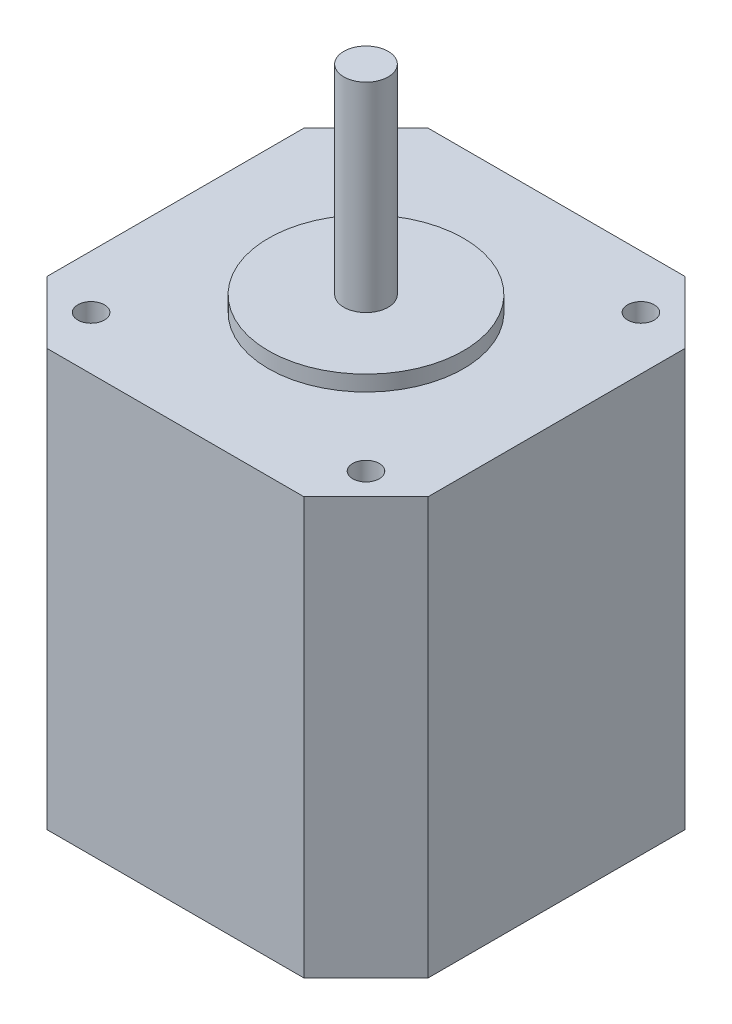
ISO-10303-21;
HEADER;
FILE_DESCRIPTION(('STEP AP214'),'2;1');
FILE_NAME('part.step','',(''),(''),'','','');
FILE_SCHEMA(('AUTOMOTIVE_DESIGN { 1 0 10303 214 1 1 1 1 }'));
ENDSEC;
DATA;
#1=APPLICATION_CONTEXT('core data for automotive mechanical design processes');
#2=APPLICATION_PROTOCOL_DEFINITION('international standard','automotive_design',2000,#1);
#3=PRODUCT_CONTEXT('',#1,'mechanical');
#4=PRODUCT('Part','Part','',(#3));
#5=PRODUCT_RELATED_PRODUCT_CATEGORY('part','',(#4));
#6=PRODUCT_DEFINITION_FORMATION('','',#4);
#7=PRODUCT_DEFINITION_CONTEXT('part definition',#1,'design');
#8=PRODUCT_DEFINITION('design','',#6,#7);
#9=PRODUCT_DEFINITION_SHAPE('','',#8);
#10=(LENGTH_UNIT() NAMED_UNIT(*) SI_UNIT(.MILLI.,.METRE.));
#11=(NAMED_UNIT(*) PLANE_ANGLE_UNIT() SI_UNIT($,.RADIAN.));
#12=(NAMED_UNIT(*) SI_UNIT($,.STERADIAN.) SOLID_ANGLE_UNIT());
#13=UNCERTAINTY_MEASURE_WITH_UNIT(LENGTH_MEASURE(1.E-05),#10,'distance_accuracy_value','');
#14=(GEOMETRIC_REPRESENTATION_CONTEXT(3) GLOBAL_UNCERTAINTY_ASSIGNED_CONTEXT((#13)) GLOBAL_UNIT_ASSIGNED_CONTEXT((#10,
#11,#12)) REPRESENTATION_CONTEXT('',''));
#15=CARTESIAN_POINT('',(0.,0.,0.));
#16=DIRECTION('',(0.,0.,1.));
#17=DIRECTION('',(1.,0.,0.));
#18=AXIS2_PLACEMENT_3D('',#15,#16,#17);
#19=CARTESIAN_POINT('',(49.,-216.5,-49.));
#20=DIRECTION('',(0.,1.,0.));
#21=DIRECTION('',(0.,0.,1.));
#22=AXIS2_PLACEMENT_3D('',#19,#20,#21);
#23=CYLINDRICAL_SURFACE('',#22,2.5);
#24=CARTESIAN_POINT('',(49.,-216.5,-49.));
#25=DIRECTION('',(0.,-1.,0.));
#26=DIRECTION('',(0.,0.,-1.));
#27=AXIS2_PLACEMENT_3D('',#24,#25,#26);
#28=CIRCLE('',#27,2.5);
#29=CARTESIAN_POINT('',(49.,-216.5,-46.5));
#30=VERTEX_POINT('',#29);
#31=EDGE_CURVE('E11',#30,#30,#28,.T.);
#32=CARTESIAN_POINT('',(49.,-194.,-49.));
#33=DIRECTION('',(0.,-1.,0.));
#34=DIRECTION('',(0.,0.,-1.));
#35=AXIS2_PLACEMENT_3D('',#32,#33,#34);
#36=CIRCLE('',#35,2.5);
#37=CARTESIAN_POINT('',(49.,-194.,-46.5));
#38=VERTEX_POINT('',#37);
#39=EDGE_CURVE('E35',#38,#38,#36,.T.);
#40=CARTESIAN_POINT('',(49.,-216.5,-46.5));
#41=CARTESIAN_POINT('',(49.,-216.265625,-46.5));
#42=CARTESIAN_POINT('',(49.,-216.03125,-46.5));
#43=CARTESIAN_POINT('',(49.,-215.5625,-46.5));
#44=CARTESIAN_POINT('',(49.,-215.328125,-46.5));
#45=CARTESIAN_POINT('',(49.,-214.859375,-46.5));
#46=CARTESIAN_POINT('',(49.,-214.625,-46.5));
#47=CARTESIAN_POINT('',(49.,-214.15625,-46.5));
#48=CARTESIAN_POINT('',(49.,-213.921875,-46.5));
#49=CARTESIAN_POINT('',(49.,-213.453125,-46.5));
#50=CARTESIAN_POINT('',(49.,-213.21875,-46.5));
#51=CARTESIAN_POINT('',(49.,-212.75,-46.5));
#52=CARTESIAN_POINT('',(49.,-212.515625,-46.5));
#53=CARTESIAN_POINT('',(49.,-212.046875,-46.5));
#54=CARTESIAN_POINT('',(49.,-211.8125,-46.5));
#55=CARTESIAN_POINT('',(49.,-211.34375,-46.5));
#56=CARTESIAN_POINT('',(49.,-211.109375,-46.5));
#57=CARTESIAN_POINT('',(49.,-210.640625,-46.5));
#58=CARTESIAN_POINT('',(49.,-210.40625,-46.5));
#59=CARTESIAN_POINT('',(49.,-209.9375,-46.5));
#60=CARTESIAN_POINT('',(49.,-209.703125,-46.5));
#61=CARTESIAN_POINT('',(49.,-209.234375,-46.5));
#62=CARTESIAN_POINT('',(49.,-209.,-46.5));
#63=CARTESIAN_POINT('',(49.,-208.53125,-46.5));
#64=CARTESIAN_POINT('',(49.,-208.296875,-46.5));
#65=CARTESIAN_POINT('',(49.,-207.828125,-46.5));
#66=CARTESIAN_POINT('',(49.,-207.59375,-46.5));
#67=CARTESIAN_POINT('',(49.,-207.125,-46.5));
#68=CARTESIAN_POINT('',(49.,-206.890625,-46.5));
#69=CARTESIAN_POINT('',(49.,-206.421875,-46.5));
#70=CARTESIAN_POINT('',(49.,-206.1875,-46.5));
#71=CARTESIAN_POINT('',(49.,-205.71875,-46.5));
#72=CARTESIAN_POINT('',(49.,-205.484375,-46.5));
#73=CARTESIAN_POINT('',(49.,-205.015625,-46.5));
#74=CARTESIAN_POINT('',(49.,-204.78125,-46.5));
#75=CARTESIAN_POINT('',(49.,-204.3125,-46.5));
#76=CARTESIAN_POINT('',(49.,-204.078125,-46.5));
#77=CARTESIAN_POINT('',(49.,-203.609375,-46.5));
#78=CARTESIAN_POINT('',(49.,-203.375,-46.5));
#79=CARTESIAN_POINT('',(49.,-202.90625,-46.5));
#80=CARTESIAN_POINT('',(49.,-202.671875,-46.5));
#81=CARTESIAN_POINT('',(49.,-202.203125,-46.5));
#82=CARTESIAN_POINT('',(49.,-201.96875,-46.5));
#83=CARTESIAN_POINT('',(49.,-201.5,-46.5));
#84=CARTESIAN_POINT('',(49.,-201.265625,-46.5));
#85=CARTESIAN_POINT('',(49.,-200.796875,-46.5));
#86=CARTESIAN_POINT('',(49.,-200.5625,-46.5));
#87=CARTESIAN_POINT('',(49.,-200.09375,-46.5));
#88=CARTESIAN_POINT('',(49.,-199.859375,-46.5));
#89=CARTESIAN_POINT('',(49.,-199.390625,-46.5));
#90=CARTESIAN_POINT('',(49.,-199.15625,-46.5));
#91=CARTESIAN_POINT('',(49.,-198.6875,-46.5));
#92=CARTESIAN_POINT('',(49.,-198.453125,-46.5));
#93=CARTESIAN_POINT('',(49.,-197.984375,-46.5));
#94=CARTESIAN_POINT('',(49.,-197.75,-46.5));
#95=CARTESIAN_POINT('',(49.,-197.28125,-46.5));
#96=CARTESIAN_POINT('',(49.,-197.046875,-46.5));
#97=CARTESIAN_POINT('',(49.,-196.578125,-46.5));
#98=CARTESIAN_POINT('',(49.,-196.34375,-46.5));
#99=CARTESIAN_POINT('',(49.,-195.875,-46.5));
#100=CARTESIAN_POINT('',(49.,-195.640625,-46.5));
#101=CARTESIAN_POINT('',(49.,-195.171875,-46.5));
#102=CARTESIAN_POINT('',(49.,-194.9375,-46.5));
#103=CARTESIAN_POINT('',(49.,-194.46875,-46.5));
#104=CARTESIAN_POINT('',(49.,-194.234375,-46.5));
#105=CARTESIAN_POINT('',(49.,-194.,-46.5));
#106=B_SPLINE_CURVE_WITH_KNOTS('',3,(#40,#41,#42,#43,#44,#45,#46,#47,#48,#49,#50,#51,#52,#53,
#54,#55,#56,#57,#58,#59,#60,#61,#62,#63,#64,#65,#66,#67,#68,#69,#70,#71,#72,#73,#74,#75,#76,#77,
#78,#79,#80,#81,#82,#83,#84,#85,#86,#87,#88,#89,#90,#91,#92,#93,#94,#95,#96,#97,#98,#99,#100,
#101,#102,#103,#104,#105),.UNSPECIFIED.,.F.,.F.,(4,2,2,2,2,2,2,2,2,2,2,2,2,2,2,2,2,2,2,2,2,2,2,
2,2,2,2,2,2,2,2,2,4),(0.,0.703125000000027,1.40625000000003,2.10937500000002,2.81250000000002,
3.51562500000002,4.21875000000002,4.92187500000002,5.62500000000002,6.32812500000002,
7.03125000000002,7.73437500000002,8.43750000000001,9.14062500000001,9.84375000000001,10.546875,
11.25,11.953125,12.65625,13.359375,14.0625,14.765625,15.46875,16.171875,16.875,17.578125,
18.28125,18.984375,19.6875,20.390625,21.09375,21.796875,22.5),.UNSPECIFIED.);
#107=EDGE_CURVE('BSEAM32',#30,#38,#106,.T.);
#108=ORIENTED_EDGE('',*,*,#31,.F.);
#109=ORIENTED_EDGE('',*,*,#39,.T.);
#110=ORIENTED_EDGE('',*,*,#107,.T.);
#111=ORIENTED_EDGE('',*,*,#107,.F.);
#112=EDGE_LOOP('',(#108,#110,#109,#111));
#113=FACE_BOUND('',#112,.T.);
#114=ADVANCED_FACE('F32',(#113),#23,.T.);
#115=CARTESIAN_POINT('',(49.,-194.,-49.));
#116=DIRECTION('',(0.,-1.,0.));
#117=DIRECTION('',(0.,0.,-1.));
#118=AXIS2_PLACEMENT_3D('',#115,#116,#117);
#119=PLANE('',#118);
#120=ORIENTED_EDGE('',*,*,#39,.F.);
#121=EDGE_LOOP('',(#120));
#122=FACE_BOUND('',#121,.T.);
#123=ADVANCED_FACE('F171',(#122),#119,.F.);
#124=CARTESIAN_POINT('',(49.,-216.5,-49.));
#125=DIRECTION('',(0.,-1.,0.));
#126=DIRECTION('',(0.,0.,-1.));
#127=AXIS2_PLACEMENT_3D('',#124,#125,#126);
#128=PLANE('',#127);
#129=CARTESIAN_POINT('',(49.,-216.5,-49.));
#130=DIRECTION('',(0.,-1.,0.));
#131=DIRECTION('',(0.,0.,-1.));
#132=AXIS2_PLACEMENT_3D('',#129,#130,#131);
#133=CIRCLE('',#132,11.);
#134=CARTESIAN_POINT('',(49.,-216.5,-60.));
#135=VERTEX_POINT('',#134);
#136=EDGE_CURVE('E159',#135,#135,#133,.T.);
#137=ORIENTED_EDGE('',*,*,#136,.F.);
#138=EDGE_LOOP('',(#137));
#139=FACE_BOUND('',#138,.T.);
#140=ORIENTED_EDGE('',*,*,#31,.T.);
#141=EDGE_LOOP('',(#140));
#142=FACE_BOUND('',#141,.T.);
#143=ADVANCED_FACE('F168',(#139,#142),#128,.F.);
#144=CARTESIAN_POINT('',(49.,-218.25,-49.));
#145=DIRECTION('',(0.,1.,0.));
#146=DIRECTION('',(0.,0.,1.));
#147=AXIS2_PLACEMENT_3D('',#144,#145,#146);
#148=CYLINDRICAL_SURFACE('',#147,11.);
#149=CARTESIAN_POINT('',(49.,-218.25,-49.));
#150=DIRECTION('',(0.,-1.,0.));
#151=DIRECTION('',(0.,0.,-1.));
#152=AXIS2_PLACEMENT_3D('',#149,#150,#151);
#153=CIRCLE('',#152,11.);
#154=CARTESIAN_POINT('',(49.,-218.25,-60.));
#155=VERTEX_POINT('',#154);
#156=EDGE_CURVE('E160',#155,#155,#153,.T.);
#157=ORIENTED_EDGE('',*,*,#156,.F.);
#158=EDGE_LOOP('',(#157));
#159=FACE_BOUND('',#158,.T.);
#160=ORIENTED_EDGE('',*,*,#136,.T.);
#161=EDGE_LOOP('',(#160));
#162=FACE_BOUND('',#161,.T.);
#163=ADVANCED_FACE('F166',(#159,#162),#148,.T.);
#164=CARTESIAN_POINT('',(0.,-218.25,0.));
#165=DIRECTION('',(0.,1.,0.));
#166=DIRECTION('',(0.,0.,1.));
#167=AXIS2_PLACEMENT_3D('',#164,#165,#166);
#168=PLANE('',#167);
#169=CARTESIAN_POINT('',(64.5000000000003,-218.25,-33.5));
#170=DIRECTION('',(0.,1.,0.));
#171=DIRECTION('',(0.,0.,1.));
#172=AXIS2_PLACEMENT_3D('',#169,#170,#171);
#173=CIRCLE('',#172,1.5);
#174=CARTESIAN_POINT('',(64.5000000000003,-218.25,-32.));
#175=VERTEX_POINT('',#174);
#176=EDGE_CURVE('E243',#175,#175,#173,.T.);
#177=ORIENTED_EDGE('',*,*,#176,.F.);
#178=EDGE_LOOP('',(#177));
#179=FACE_BOUND('',#178,.T.);
#180=CARTESIAN_POINT('',(33.5000000000003,-218.25,-33.4999999999998));
#181=DIRECTION('',(0.,1.,0.));
#182=DIRECTION('',(0.,0.,1.));
#183=AXIS2_PLACEMENT_3D('',#180,#181,#182);
#184=CIRCLE('',#183,1.5);
#185=CARTESIAN_POINT('',(33.5000000000003,-218.25,-31.9999999999998));
#186=VERTEX_POINT('',#185);
#187=EDGE_CURVE('E245',#186,#186,#184,.T.);
#188=ORIENTED_EDGE('',*,*,#187,.F.);
#189=EDGE_LOOP('',(#188));
#190=FACE_BOUND('',#189,.T.);
#191=CARTESIAN_POINT('',(33.5,-218.25,-64.4999999999998));
#192=DIRECTION('',(0.,1.,0.));
#193=DIRECTION('',(0.,0.,1.));
#194=AXIS2_PLACEMENT_3D('',#191,#192,#193);
#195=CIRCLE('',#194,1.5);
#196=CARTESIAN_POINT('',(33.5,-218.25,-62.9999999999998));
#197=VERTEX_POINT('',#196);
#198=EDGE_CURVE('E251',#197,#197,#195,.T.);
#199=ORIENTED_EDGE('',*,*,#198,.F.);
#200=EDGE_LOOP('',(#199));
#201=FACE_BOUND('',#200,.T.);
#202=CARTESIAN_POINT('',(64.5,-218.25,-64.5));
#203=DIRECTION('',(0.,1.,0.));
#204=DIRECTION('',(0.,0.,1.));
#205=AXIS2_PLACEMENT_3D('',#202,#203,#204);
#206=CIRCLE('',#205,1.5);
#207=CARTESIAN_POINT('',(64.5,-218.25,-63.));
#208=VERTEX_POINT('',#207);
#209=EDGE_CURVE('E257',#208,#208,#206,.T.);
#210=ORIENTED_EDGE('',*,*,#209,.F.);
#211=EDGE_LOOP('',(#210));
#212=FACE_BOUND('',#211,.T.);
#213=DIRECTION('',(-0.707106781186548,0.,-0.707106781186547));
#214=VECTOR('',#213,1.);
#215=CARTESIAN_POINT('',(27.5,-218.25,-34.5));
#216=LINE('',#215,#214);
#217=CARTESIAN_POINT('',(34.5,-218.25,-27.5));
#218=VERTEX_POINT('',#217);
#219=CARTESIAN_POINT('',(27.5,-218.25,-34.5));
#220=VERTEX_POINT('',#219);
#221=EDGE_CURVE('E129',#218,#220,#216,.T.);
#222=ORIENTED_EDGE('',*,*,#221,.F.);
#223=DIRECTION('',(-1.,0.,0.));
#224=VECTOR('',#223,1.);
#225=CARTESIAN_POINT('',(34.5,-218.25,-27.5));
#226=LINE('',#225,#224);
#227=CARTESIAN_POINT('',(63.5,-218.25,-27.5));
#228=VERTEX_POINT('',#227);
#229=EDGE_CURVE('E83',#228,#218,#226,.T.);
#230=ORIENTED_EDGE('',*,*,#229,.F.);
#231=DIRECTION('',(-0.707106781186548,0.,0.707106781186547));
#232=VECTOR('',#231,1.);
#233=CARTESIAN_POINT('',(63.5,-218.25,-27.5));
#234=LINE('',#233,#232);
#235=CARTESIAN_POINT('',(70.5,-218.25,-34.5));
#236=VERTEX_POINT('',#235);
#237=EDGE_CURVE('E77',#236,#228,#234,.T.);
#238=ORIENTED_EDGE('',*,*,#237,.F.);
#239=DIRECTION('',(0.,0.,1.));
#240=VECTOR('',#239,1.);
#241=CARTESIAN_POINT('',(70.5,-218.25,-34.5));
#242=LINE('',#241,#240);
#243=CARTESIAN_POINT('',(70.5,-218.25,-63.5));
#244=VERTEX_POINT('',#243);
#245=EDGE_CURVE('E119',#244,#236,#242,.T.);
#246=ORIENTED_EDGE('',*,*,#245,.F.);
#247=DIRECTION('',(0.707106781186547,0.,0.707106781186547));
#248=VECTOR('',#247,1.);
#249=CARTESIAN_POINT('',(63.5,-218.25,-70.5));
#250=LINE('',#249,#248);
#251=CARTESIAN_POINT('',(63.5,-218.25,-70.5));
#252=VERTEX_POINT('',#251);
#253=EDGE_CURVE('E139',#252,#244,#250,.T.);
#254=ORIENTED_EDGE('',*,*,#253,.F.);
#255=DIRECTION('',(1.,0.,0.));
#256=VECTOR('',#255,1.);
#257=CARTESIAN_POINT('',(34.5,-218.25,-70.5));
#258=LINE('',#257,#256);
#259=CARTESIAN_POINT('',(34.5,-218.25,-70.5));
#260=VERTEX_POINT('',#259);
#261=EDGE_CURVE('E137',#260,#252,#258,.T.);
#262=ORIENTED_EDGE('',*,*,#261,.F.);
#263=DIRECTION('',(0.707106781186547,0.,-0.707106781186548));
#264=VECTOR('',#263,1.);
#265=CARTESIAN_POINT('',(27.5,-218.25,-63.5));
#266=LINE('',#265,#264);
#267=CARTESIAN_POINT('',(27.5,-218.25,-63.5));
#268=VERTEX_POINT('',#267);
#269=EDGE_CURVE('E135',#268,#260,#266,.T.);
#270=ORIENTED_EDGE('',*,*,#269,.F.);
#271=DIRECTION('',(0.,0.,-1.));
#272=VECTOR('',#271,1.);
#273=CARTESIAN_POINT('',(27.5,-218.25,-34.5));
#274=LINE('',#273,#272);
#275=EDGE_CURVE('E132',#220,#268,#274,.T.);
#276=ORIENTED_EDGE('',*,*,#275,.F.);
#277=EDGE_LOOP('',(#222,#230,#238,#246,#254,#262,#270,#276));
#278=FACE_BOUND('',#277,.T.);
#279=ORIENTED_EDGE('',*,*,#156,.T.);
#280=EDGE_LOOP('',(#279));
#281=FACE_BOUND('',#280,.T.);
#282=ADVANCED_FACE('F185',(#179,#190,#201,#212,#278,#281),#168,.T.);
#283=CARTESIAN_POINT('',(27.5,-265.25,-34.5));
#284=DIRECTION('',(0.707106781186547,0.,-0.707106781186548));
#285=DIRECTION('',(-0.707106781186548,0.,-0.707106781186547));
#286=AXIS2_PLACEMENT_3D('',#283,#284,#285);
#287=PLANE('',#286);
#288=ORIENTED_EDGE('',*,*,#221,.T.);
#289=DIRECTION('',(0.,1.,0.));
#290=VECTOR('',#289,1.);
#291=CARTESIAN_POINT('',(27.5,-265.25,-34.5));
#292=LINE('',#291,#290);
#293=CARTESIAN_POINT('',(27.5,-265.25,-34.5));
#294=VERTEX_POINT('',#293);
#295=EDGE_CURVE('E157',#294,#220,#292,.T.);
#296=ORIENTED_EDGE('',*,*,#295,.F.);
#297=DIRECTION('',(-0.707106781186548,0.,-0.707106781186547));
#298=VECTOR('',#297,1.);
#299=CARTESIAN_POINT('',(27.5,-265.25,-34.5));
#300=LINE('',#299,#298);
#301=CARTESIAN_POINT('',(34.5,-265.25,-27.5));
#302=VERTEX_POINT('',#301);
#303=EDGE_CURVE('E144',#302,#294,#300,.T.);
#304=ORIENTED_EDGE('',*,*,#303,.F.);
#305=DIRECTION('',(0.,1.,0.));
#306=VECTOR('',#305,1.);
#307=CARTESIAN_POINT('',(34.5,-265.25,-27.5));
#308=LINE('',#307,#306);
#309=EDGE_CURVE('E125',#302,#218,#308,.T.);
#310=ORIENTED_EDGE('',*,*,#309,.T.);
#311=EDGE_LOOP('',(#288,#296,#304,#310));
#312=FACE_BOUND('',#311,.T.);
#313=ADVANCED_FACE('F188',(#312),#287,.F.);
#314=CARTESIAN_POINT('',(27.5,-265.25,-34.5));
#315=DIRECTION('',(1.,0.,0.));
#316=DIRECTION('',(0.,0.,-1.));
#317=AXIS2_PLACEMENT_3D('',#314,#315,#316);
#318=PLANE('',#317);
#319=ORIENTED_EDGE('',*,*,#275,.T.);
#320=DIRECTION('',(0.,1.,0.));
#321=VECTOR('',#320,1.);
#322=CARTESIAN_POINT('',(27.5,-265.25,-63.5));
#323=LINE('',#322,#321);
#324=CARTESIAN_POINT('',(27.5,-265.25,-63.5));
#325=VERTEX_POINT('',#324);
#326=EDGE_CURVE('E154',#325,#268,#323,.T.);
#327=ORIENTED_EDGE('',*,*,#326,.F.);
#328=DIRECTION('',(0.,0.,-1.));
#329=VECTOR('',#328,1.);
#330=CARTESIAN_POINT('',(27.5,-265.25,-34.5));
#331=LINE('',#330,#329);
#332=EDGE_CURVE('E92',#294,#325,#331,.T.);
#333=ORIENTED_EDGE('',*,*,#332,.F.);
#334=ORIENTED_EDGE('',*,*,#295,.T.);
#335=EDGE_LOOP('',(#319,#327,#333,#334));
#336=FACE_BOUND('',#335,.T.);
#337=ADVANCED_FACE('F191',(#336),#318,.F.);
#338=CARTESIAN_POINT('',(27.5,-265.25,-63.5));
#339=DIRECTION('',(0.707106781186548,0.,0.707106781186547));
#340=DIRECTION('',(0.707106781186547,0.,-0.707106781186548));
#341=AXIS2_PLACEMENT_3D('',#338,#339,#340);
#342=PLANE('',#341);
#343=ORIENTED_EDGE('',*,*,#269,.T.);
#344=DIRECTION('',(0.,1.,0.));
#345=VECTOR('',#344,1.);
#346=CARTESIAN_POINT('',(34.5,-265.25,-70.5));
#347=LINE('',#346,#345);
#348=CARTESIAN_POINT('',(34.5,-265.25,-70.5));
#349=VERTEX_POINT('',#348);
#350=EDGE_CURVE('E151',#349,#260,#347,.T.);
#351=ORIENTED_EDGE('',*,*,#350,.F.);
#352=DIRECTION('',(0.707106781186547,0.,-0.707106781186548));
#353=VECTOR('',#352,1.);
#354=CARTESIAN_POINT('',(27.5,-265.25,-63.5));
#355=LINE('',#354,#353);
#356=EDGE_CURVE('E266',#325,#349,#355,.T.);
#357=ORIENTED_EDGE('',*,*,#356,.F.);
#358=ORIENTED_EDGE('',*,*,#326,.T.);
#359=EDGE_LOOP('',(#343,#351,#357,#358));
#360=FACE_BOUND('',#359,.T.);
#361=ADVANCED_FACE('F195',(#360),#342,.F.);
#362=CARTESIAN_POINT('',(34.5,-265.25,-70.5));
#363=DIRECTION('',(0.,0.,1.));
#364=DIRECTION('',(1.,0.,0.));
#365=AXIS2_PLACEMENT_3D('',#362,#363,#364);
#366=PLANE('',#365);
#367=ORIENTED_EDGE('',*,*,#261,.T.);
#368=DIRECTION('',(0.,1.,0.));
#369=VECTOR('',#368,1.);
#370=CARTESIAN_POINT('',(63.5,-265.25,-70.5));
#371=LINE('',#370,#369);
#372=CARTESIAN_POINT('',(63.5,-265.25,-70.5));
#373=VERTEX_POINT('',#372);
#374=EDGE_CURVE('E148',#373,#252,#371,.T.);
#375=ORIENTED_EDGE('',*,*,#374,.F.);
#376=DIRECTION('',(1.,0.,0.));
#377=VECTOR('',#376,1.);
#378=CARTESIAN_POINT('',(34.5,-265.25,-70.5));
#379=LINE('',#378,#377);
#380=EDGE_CURVE('E268',#349,#373,#379,.T.);
#381=ORIENTED_EDGE('',*,*,#380,.F.);
#382=ORIENTED_EDGE('',*,*,#350,.T.);
#383=EDGE_LOOP('',(#367,#375,#381,#382));
#384=FACE_BOUND('',#383,.T.);
#385=ADVANCED_FACE('F198',(#384),#366,.F.);
#386=CARTESIAN_POINT('',(63.5,-265.25,-70.5));
#387=DIRECTION('',(-0.707106781186547,0.,0.707106781186547));
#388=DIRECTION('',(0.707106781186548,0.,0.707106781186548));
#389=AXIS2_PLACEMENT_3D('',#386,#387,#388);
#390=PLANE('',#389);
#391=ORIENTED_EDGE('',*,*,#253,.T.);
#392=DIRECTION('',(0.,1.,0.));
#393=VECTOR('',#392,1.);
#394=CARTESIAN_POINT('',(70.5,-265.25,-63.5));
#395=LINE('',#394,#393);
#396=CARTESIAN_POINT('',(70.5,-265.25,-63.5));
#397=VERTEX_POINT('',#396);
#398=EDGE_CURVE('E120',#397,#244,#395,.T.);
#399=ORIENTED_EDGE('',*,*,#398,.F.);
#400=DIRECTION('',(0.707106781186547,0.,0.707106781186547));
#401=VECTOR('',#400,1.);
#402=CARTESIAN_POINT('',(63.5,-265.25,-70.5));
#403=LINE('',#402,#401);
#404=EDGE_CURVE('E111',#373,#397,#403,.T.);
#405=ORIENTED_EDGE('',*,*,#404,.F.);
#406=ORIENTED_EDGE('',*,*,#374,.T.);
#407=EDGE_LOOP('',(#391,#399,#405,#406));
#408=FACE_BOUND('',#407,.T.);
#409=ADVANCED_FACE('F202',(#408),#390,.F.);
#410=CARTESIAN_POINT('',(70.5,-265.25,-34.5));
#411=DIRECTION('',(-1.,0.,0.));
#412=DIRECTION('',(0.,0.,1.));
#413=AXIS2_PLACEMENT_3D('',#410,#411,#412);
#414=PLANE('',#413);
#415=ORIENTED_EDGE('',*,*,#245,.T.);
#416=DIRECTION('',(0.,1.,0.));
#417=VECTOR('',#416,1.);
#418=CARTESIAN_POINT('',(70.5,-265.25,-34.5));
#419=LINE('',#418,#417);
#420=CARTESIAN_POINT('',(70.5,-265.25,-34.5));
#421=VERTEX_POINT('',#420);
#422=EDGE_CURVE('E116',#421,#236,#419,.T.);
#423=ORIENTED_EDGE('',*,*,#422,.F.);
#424=DIRECTION('',(0.,0.,1.));
#425=VECTOR('',#424,1.);
#426=CARTESIAN_POINT('',(70.5,-265.25,-34.5));
#427=LINE('',#426,#425);
#428=EDGE_CURVE('E105',#397,#421,#427,.T.);
#429=ORIENTED_EDGE('',*,*,#428,.F.);
#430=ORIENTED_EDGE('',*,*,#398,.T.);
#431=EDGE_LOOP('',(#415,#423,#429,#430));
#432=FACE_BOUND('',#431,.T.);
#433=ADVANCED_FACE('F117',(#432),#414,.F.);
#434=CARTESIAN_POINT('',(63.5,-265.25,-27.5));
#435=DIRECTION('',(-0.707106781186547,0.,-0.707106781186548));
#436=DIRECTION('',(-0.707106781186548,0.,0.707106781186547));
#437=AXIS2_PLACEMENT_3D('',#434,#435,#436);
#438=PLANE('',#437);
#439=ORIENTED_EDGE('',*,*,#237,.T.);
#440=DIRECTION('',(0.,1.,0.));
#441=VECTOR('',#440,1.);
#442=CARTESIAN_POINT('',(63.5,-265.25,-27.5));
#443=LINE('',#442,#441);
#444=CARTESIAN_POINT('',(63.5,-265.25,-27.5));
#445=VERTEX_POINT('',#444);
#446=EDGE_CURVE('E121',#445,#228,#443,.T.);
#447=ORIENTED_EDGE('',*,*,#446,.F.);
#448=DIRECTION('',(-0.707106781186548,0.,0.707106781186547));
#449=VECTOR('',#448,1.);
#450=CARTESIAN_POINT('',(63.5,-265.25,-27.5));
#451=LINE('',#450,#449);
#452=EDGE_CURVE('E109',#421,#445,#451,.T.);
#453=ORIENTED_EDGE('',*,*,#452,.F.);
#454=ORIENTED_EDGE('',*,*,#422,.T.);
#455=EDGE_LOOP('',(#439,#447,#453,#454));
#456=FACE_BOUND('',#455,.T.);
#457=ADVANCED_FACE('F123',(#456),#438,.F.);
#458=CARTESIAN_POINT('',(34.5,-265.25,-27.5));
#459=DIRECTION('',(0.,0.,-1.));
#460=DIRECTION('',(-1.,0.,0.));
#461=AXIS2_PLACEMENT_3D('',#458,#459,#460);
#462=PLANE('',#461);
#463=ORIENTED_EDGE('',*,*,#229,.T.);
#464=ORIENTED_EDGE('',*,*,#309,.F.);
#465=DIRECTION('',(-1.,0.,0.));
#466=VECTOR('',#465,1.);
#467=CARTESIAN_POINT('',(34.5,-265.25,-27.5));
#468=LINE('',#467,#466);
#469=EDGE_CURVE('E48',#445,#302,#468,.T.);
#470=ORIENTED_EDGE('',*,*,#469,.F.);
#471=ORIENTED_EDGE('',*,*,#446,.T.);
#472=EDGE_LOOP('',(#463,#464,#470,#471));
#473=FACE_BOUND('',#472,.T.);
#474=ADVANCED_FACE('F211',(#473),#462,.F.);
#475=CARTESIAN_POINT('',(0.,-265.25,0.));
#476=DIRECTION('',(0.,1.,0.));
#477=DIRECTION('',(0.,0.,1.));
#478=AXIS2_PLACEMENT_3D('',#475,#476,#477);
#479=PLANE('',#478);
#480=CARTESIAN_POINT('',(64.5000000000003,-265.25,-33.5));
#481=DIRECTION('',(0.,1.,0.));
#482=DIRECTION('',(0.,0.,1.));
#483=AXIS2_PLACEMENT_3D('',#480,#481,#482);
#484=CIRCLE('',#483,1.5);
#485=CARTESIAN_POINT('',(64.5000000000003,-265.25,-32.));
#486=VERTEX_POINT('',#485);
#487=EDGE_CURVE('E240',#486,#486,#484,.T.);
#488=ORIENTED_EDGE('',*,*,#487,.T.);
#489=EDGE_LOOP('',(#488));
#490=FACE_BOUND('',#489,.T.);
#491=CARTESIAN_POINT('',(33.5000000000003,-265.25,-33.4999999999998));
#492=DIRECTION('',(0.,1.,0.));
#493=DIRECTION('',(0.,0.,1.));
#494=AXIS2_PLACEMENT_3D('',#491,#492,#493);
#495=CIRCLE('',#494,1.5);
#496=CARTESIAN_POINT('',(33.5000000000003,-265.25,-31.9999999999998));
#497=VERTEX_POINT('',#496);
#498=EDGE_CURVE('E248',#497,#497,#495,.T.);
#499=ORIENTED_EDGE('',*,*,#498,.T.);
#500=EDGE_LOOP('',(#499));
#501=FACE_BOUND('',#500,.T.);
#502=CARTESIAN_POINT('',(33.5,-265.25,-64.4999999999998));
#503=DIRECTION('',(0.,1.,0.));
#504=DIRECTION('',(0.,0.,1.));
#505=AXIS2_PLACEMENT_3D('',#502,#503,#504);
#506=CIRCLE('',#505,1.5);
#507=CARTESIAN_POINT('',(33.5,-265.25,-62.9999999999998));
#508=VERTEX_POINT('',#507);
#509=EDGE_CURVE('E254',#508,#508,#506,.T.);
#510=ORIENTED_EDGE('',*,*,#509,.T.);
#511=EDGE_LOOP('',(#510));
#512=FACE_BOUND('',#511,.T.);
#513=CARTESIAN_POINT('',(64.5,-265.25,-64.5));
#514=DIRECTION('',(0.,1.,0.));
#515=DIRECTION('',(0.,0.,1.));
#516=AXIS2_PLACEMENT_3D('',#513,#514,#515);
#517=CIRCLE('',#516,1.5);
#518=CARTESIAN_POINT('',(64.5,-265.25,-63.));
#519=VERTEX_POINT('',#518);
#520=EDGE_CURVE('E133',#519,#519,#517,.T.);
#521=ORIENTED_EDGE('',*,*,#520,.T.);
#522=EDGE_LOOP('',(#521));
#523=FACE_BOUND('',#522,.T.);
#524=ORIENTED_EDGE('',*,*,#303,.T.);
#525=ORIENTED_EDGE('',*,*,#332,.T.);
#526=ORIENTED_EDGE('',*,*,#356,.T.);
#527=ORIENTED_EDGE('',*,*,#380,.T.);
#528=ORIENTED_EDGE('',*,*,#404,.T.);
#529=ORIENTED_EDGE('',*,*,#428,.T.);
#530=ORIENTED_EDGE('',*,*,#452,.T.);
#531=ORIENTED_EDGE('',*,*,#469,.T.);
#532=EDGE_LOOP('',(#524,#525,#526,#527,#528,#529,#530,#531));
#533=FACE_BOUND('',#532,.T.);
#534=ADVANCED_FACE('F107',(#490,#501,#512,#523,#533),#479,.F.);
#535=CARTESIAN_POINT('',(64.5,-265.25,-64.5));
#536=DIRECTION('',(0.,1.,0.));
#537=DIRECTION('',(0.,0.,1.));
#538=AXIS2_PLACEMENT_3D('',#535,#536,#537);
#539=CYLINDRICAL_SURFACE('',#538,1.5);
#540=ORIENTED_EDGE('',*,*,#520,.F.);
#541=EDGE_LOOP('',(#540));
#542=FACE_BOUND('',#541,.T.);
#543=ORIENTED_EDGE('',*,*,#209,.T.);
#544=EDGE_LOOP('',(#543));
#545=FACE_BOUND('',#544,.T.);
#546=ADVANCED_FACE('F219',(#542,#545),#539,.F.);
#547=CARTESIAN_POINT('',(33.5,-265.25,-64.4999999999998));
#548=DIRECTION('',(0.,1.,0.));
#549=DIRECTION('',(0.,0.,1.));
#550=AXIS2_PLACEMENT_3D('',#547,#548,#549);
#551=CYLINDRICAL_SURFACE('',#550,1.5);
#552=ORIENTED_EDGE('',*,*,#509,.F.);
#553=EDGE_LOOP('',(#552));
#554=FACE_BOUND('',#553,.T.);
#555=ORIENTED_EDGE('',*,*,#198,.T.);
#556=EDGE_LOOP('',(#555));
#557=FACE_BOUND('',#556,.T.);
#558=ADVANCED_FACE('F223',(#554,#557),#551,.F.);
#559=CARTESIAN_POINT('',(33.5000000000003,-265.25,-33.4999999999998));
#560=DIRECTION('',(0.,1.,0.));
#561=DIRECTION('',(0.,0.,1.));
#562=AXIS2_PLACEMENT_3D('',#559,#560,#561);
#563=CYLINDRICAL_SURFACE('',#562,1.5);
#564=ORIENTED_EDGE('',*,*,#498,.F.);
#565=EDGE_LOOP('',(#564));
#566=FACE_BOUND('',#565,.T.);
#567=ORIENTED_EDGE('',*,*,#187,.T.);
#568=EDGE_LOOP('',(#567));
#569=FACE_BOUND('',#568,.T.);
#570=ADVANCED_FACE('F227',(#566,#569),#563,.F.);
#571=CARTESIAN_POINT('',(64.5000000000003,-265.25,-33.5));
#572=DIRECTION('',(0.,1.,0.));
#573=DIRECTION('',(0.,0.,1.));
#574=AXIS2_PLACEMENT_3D('',#571,#572,#573);
#575=CYLINDRICAL_SURFACE('',#574,1.5);
#576=ORIENTED_EDGE('',*,*,#487,.F.);
#577=EDGE_LOOP('',(#576));
#578=FACE_BOUND('',#577,.T.);
#579=ORIENTED_EDGE('',*,*,#176,.T.);
#580=EDGE_LOOP('',(#579));
#581=FACE_BOUND('',#580,.T.);
#582=ADVANCED_FACE('F231',(#578,#581),#575,.F.);
#583=CLOSED_SHELL('',(#114,#123,#143,#163,#282,#313,#337,#361,#385,#409,#433,#457,#474,#534,
#546,#558,#570,#582));
#584=MANIFOLD_SOLID_BREP('B2',#583);
#585=ADVANCED_BREP_SHAPE_REPRESENTATION('',(#18,#584),#14);
#586=SHAPE_DEFINITION_REPRESENTATION(#9,#585);
ENDSEC;
END-ISO-10303-21;
